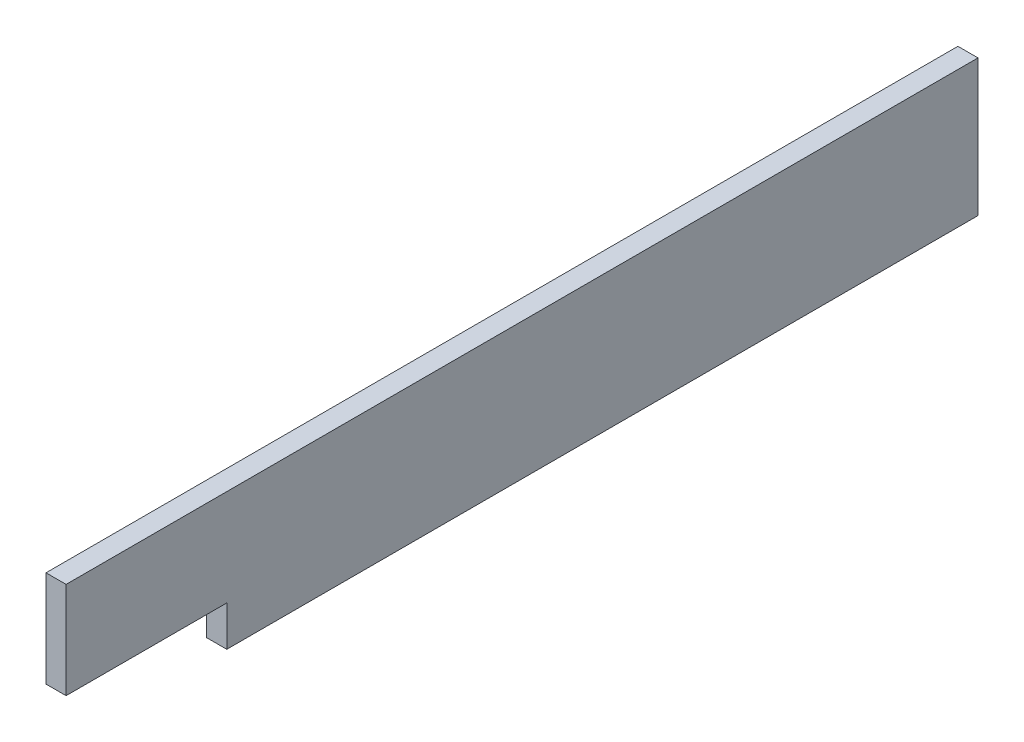
ISO-10303-21;
HEADER;
FILE_DESCRIPTION(('STEP AP214'),'2;1');
FILE_NAME('part.step','',(''),(''),'','','');
FILE_SCHEMA(('AUTOMOTIVE_DESIGN { 1 0 10303 214 1 1 1 1 }'));
ENDSEC;
DATA;
#1=APPLICATION_CONTEXT('core data for automotive mechanical design processes');
#2=APPLICATION_PROTOCOL_DEFINITION('international standard','automotive_design',2000,#1);
#3=PRODUCT_CONTEXT('',#1,'mechanical');
#4=PRODUCT('Part','Part','',(#3));
#5=PRODUCT_RELATED_PRODUCT_CATEGORY('part','',(#4));
#6=PRODUCT_DEFINITION_FORMATION('','',#4);
#7=PRODUCT_DEFINITION_CONTEXT('part definition',#1,'design');
#8=PRODUCT_DEFINITION('design','',#6,#7);
#9=PRODUCT_DEFINITION_SHAPE('','',#8);
#10=(LENGTH_UNIT() NAMED_UNIT(*) SI_UNIT(.MILLI.,.METRE.));
#11=(NAMED_UNIT(*) PLANE_ANGLE_UNIT() SI_UNIT($,.RADIAN.));
#12=(NAMED_UNIT(*) SI_UNIT($,.STERADIAN.) SOLID_ANGLE_UNIT());
#13=UNCERTAINTY_MEASURE_WITH_UNIT(LENGTH_MEASURE(1.E-05),#10,'distance_accuracy_value','');
#14=(GEOMETRIC_REPRESENTATION_CONTEXT(3) GLOBAL_UNCERTAINTY_ASSIGNED_CONTEXT((#13)) GLOBAL_UNIT_ASSIGNED_CONTEXT((#10,
#11,#12)) REPRESENTATION_CONTEXT('',''));
#15=CARTESIAN_POINT('',(0.,0.,0.));
#16=DIRECTION('',(0.,0.,1.));
#17=DIRECTION('',(1.,0.,0.));
#18=AXIS2_PLACEMENT_3D('',#15,#16,#17);
#19=CARTESIAN_POINT('',(0.,0.,288.29));
#20=DIRECTION('',(1.,0.,0.));
#21=DIRECTION('',(0.,0.,-1.));
#22=AXIS2_PLACEMENT_3D('',#19,#20,#21);
#23=PLANE('',#22);
#24=DIRECTION('',(0.,0.,-1.));
#25=VECTOR('',#24,1.);
#26=CARTESIAN_POINT('',(0.,0.,288.29));
#27=LINE('',#26,#25);
#28=CARTESIAN_POINT('',(0.,0.,237.49));
#29=VERTEX_POINT('',#28);
#30=CARTESIAN_POINT('',(0.,0.,0.));
#31=VERTEX_POINT('',#30);
#32=EDGE_CURVE('E11',#29,#31,#27,.T.);
#33=ORIENTED_EDGE('',*,*,#32,.F.);
#34=DIRECTION('',(0.,-1.,0.));
#35=VECTOR('',#34,1.);
#36=CARTESIAN_POINT('',(0.,0.,237.49));
#37=LINE('',#36,#35);
#38=CARTESIAN_POINT('',(0.,12.7,237.49));
#39=VERTEX_POINT('',#38);
#40=EDGE_CURVE('E134',#39,#29,#37,.T.);
#41=ORIENTED_EDGE('',*,*,#40,.F.);
#42=DIRECTION('',(0.,0.,-1.));
#43=VECTOR('',#42,1.);
#44=CARTESIAN_POINT('',(0.,12.7,288.29));
#45=LINE('',#44,#43);
#46=CARTESIAN_POINT('',(0.,12.7,288.29));
#47=VERTEX_POINT('',#46);
#48=EDGE_CURVE('E163',#47,#39,#45,.T.);
#49=ORIENTED_EDGE('',*,*,#48,.F.);
#50=DIRECTION('',(0.,-1.,0.));
#51=VECTOR('',#50,1.);
#52=CARTESIAN_POINT('',(0.,0.,288.29));
#53=LINE('',#52,#51);
#54=CARTESIAN_POINT('',(0.,43.18,288.29));
#55=VERTEX_POINT('',#54);
#56=EDGE_CURVE('E92',#55,#47,#53,.T.);
#57=ORIENTED_EDGE('',*,*,#56,.F.);
#58=DIRECTION('',(0.,0.,-1.));
#59=VECTOR('',#58,1.);
#60=CARTESIAN_POINT('',(0.,43.18,288.29));
#61=LINE('',#60,#59);
#62=CARTESIAN_POINT('',(0.,43.18,0.));
#63=VERTEX_POINT('',#62);
#64=EDGE_CURVE('E84',#55,#63,#61,.T.);
#65=ORIENTED_EDGE('',*,*,#64,.T.);
#66=DIRECTION('',(0.,-1.,0.));
#67=VECTOR('',#66,1.);
#68=CARTESIAN_POINT('',(0.,0.,0.));
#69=LINE('',#68,#67);
#70=EDGE_CURVE('E98',#63,#31,#69,.T.);
#71=ORIENTED_EDGE('',*,*,#70,.T.);
#72=EDGE_LOOP('',(#33,#41,#49,#57,#65,#71));
#73=FACE_BOUND('',#72,.T.);
#74=ADVANCED_FACE('F39',(#73),#23,.F.);
#75=CARTESIAN_POINT('',(0.,0.,288.29));
#76=DIRECTION('',(0.,1.,0.));
#77=DIRECTION('',(0.,0.,1.));
#78=AXIS2_PLACEMENT_3D('',#75,#76,#77);
#79=PLANE('',#78);
#80=DIRECTION('',(0.,0.,-1.));
#81=VECTOR('',#80,1.);
#82=CARTESIAN_POINT('',(6.35,0.,288.29));
#83=LINE('',#82,#81);
#84=CARTESIAN_POINT('',(6.35,0.,237.49));
#85=VERTEX_POINT('',#84);
#86=CARTESIAN_POINT('',(6.35,0.,0.));
#87=VERTEX_POINT('',#86);
#88=EDGE_CURVE('E47',#85,#87,#83,.T.);
#89=ORIENTED_EDGE('',*,*,#88,.F.);
#90=DIRECTION('',(-1.,0.,0.));
#91=VECTOR('',#90,1.);
#92=CARTESIAN_POINT('',(6.351,0.,237.49));
#93=LINE('',#92,#91);
#94=EDGE_CURVE('E111',#85,#29,#93,.T.);
#95=ORIENTED_EDGE('',*,*,#94,.T.);
#96=ORIENTED_EDGE('',*,*,#32,.T.);
#97=DIRECTION('',(1.,0.,0.));
#98=VECTOR('',#97,1.);
#99=CARTESIAN_POINT('',(0.,0.,0.));
#100=LINE('',#99,#98);
#101=EDGE_CURVE('E105',#31,#87,#100,.T.);
#102=ORIENTED_EDGE('',*,*,#101,.T.);
#103=EDGE_LOOP('',(#89,#95,#96,#102));
#104=FACE_BOUND('',#103,.T.);
#105=ADVANCED_FACE('F128',(#104),#79,.F.);
#106=CARTESIAN_POINT('',(6.35,0.,288.29));
#107=DIRECTION('',(-1.,0.,0.));
#108=DIRECTION('',(0.,0.,1.));
#109=AXIS2_PLACEMENT_3D('',#106,#107,#108);
#110=PLANE('',#109);
#111=DIRECTION('',(0.,0.,1.));
#112=VECTOR('',#111,1.);
#113=CARTESIAN_POINT('',(6.35,12.7,288.29));
#114=LINE('',#113,#112);
#115=CARTESIAN_POINT('',(6.35,12.7,237.49));
#116=VERTEX_POINT('',#115);
#117=CARTESIAN_POINT('',(6.35,12.7,288.29));
#118=VERTEX_POINT('',#117);
#119=EDGE_CURVE('E54',#116,#118,#114,.T.);
#120=ORIENTED_EDGE('',*,*,#119,.F.);
#121=DIRECTION('',(0.,1.,0.));
#122=VECTOR('',#121,1.);
#123=CARTESIAN_POINT('',(6.35,0.,237.49));
#124=LINE('',#123,#122);
#125=EDGE_CURVE('E125',#85,#116,#124,.T.);
#126=ORIENTED_EDGE('',*,*,#125,.F.);
#127=ORIENTED_EDGE('',*,*,#88,.T.);
#128=DIRECTION('',(0.,1.,0.));
#129=VECTOR('',#128,1.);
#130=CARTESIAN_POINT('',(6.35,0.,0.));
#131=LINE('',#130,#129);
#132=CARTESIAN_POINT('',(6.35,43.18,0.));
#133=VERTEX_POINT('',#132);
#134=EDGE_CURVE('E93',#87,#133,#131,.T.);
#135=ORIENTED_EDGE('',*,*,#134,.T.);
#136=DIRECTION('',(0.,0.,-1.));
#137=VECTOR('',#136,1.);
#138=CARTESIAN_POINT('',(6.35,43.18,288.29));
#139=LINE('',#138,#137);
#140=CARTESIAN_POINT('',(6.35,43.18,288.29));
#141=VERTEX_POINT('',#140);
#142=EDGE_CURVE('E87',#141,#133,#139,.T.);
#143=ORIENTED_EDGE('',*,*,#142,.F.);
#144=DIRECTION('',(0.,1.,0.));
#145=VECTOR('',#144,1.);
#146=CARTESIAN_POINT('',(6.35,0.,288.29));
#147=LINE('',#146,#145);
#148=EDGE_CURVE('E156',#118,#141,#147,.T.);
#149=ORIENTED_EDGE('',*,*,#148,.F.);
#150=EDGE_LOOP('',(#120,#126,#127,#135,#143,#149));
#151=FACE_BOUND('',#150,.T.);
#152=ADVANCED_FACE('F123',(#151),#110,.F.);
#153=CARTESIAN_POINT('',(0.,43.18,288.29));
#154=DIRECTION('',(0.,-1.,0.));
#155=DIRECTION('',(0.,0.,-1.));
#156=AXIS2_PLACEMENT_3D('',#153,#154,#155);
#157=PLANE('',#156);
#158=DIRECTION('',(-1.,0.,0.));
#159=VECTOR('',#158,1.);
#160=CARTESIAN_POINT('',(0.,43.18,0.));
#161=LINE('',#160,#159);
#162=EDGE_CURVE('E81',#133,#63,#161,.T.);
#163=ORIENTED_EDGE('',*,*,#162,.T.);
#164=ORIENTED_EDGE('',*,*,#64,.F.);
#165=DIRECTION('',(-1.,0.,0.));
#166=VECTOR('',#165,1.);
#167=CARTESIAN_POINT('',(0.,43.18,288.29));
#168=LINE('',#167,#166);
#169=EDGE_CURVE('E63',#141,#55,#168,.T.);
#170=ORIENTED_EDGE('',*,*,#169,.F.);
#171=ORIENTED_EDGE('',*,*,#142,.T.);
#172=EDGE_LOOP('',(#163,#164,#170,#171));
#173=FACE_BOUND('',#172,.T.);
#174=ADVANCED_FACE('F83',(#173),#157,.F.);
#175=CARTESIAN_POINT('',(0.,0.,288.29));
#176=DIRECTION('',(0.,0.,-1.));
#177=DIRECTION('',(-1.,0.,0.));
#178=AXIS2_PLACEMENT_3D('',#175,#176,#177);
#179=PLANE('',#178);
#180=ORIENTED_EDGE('',*,*,#56,.T.);
#181=DIRECTION('',(-1.,0.,0.));
#182=VECTOR('',#181,1.);
#183=CARTESIAN_POINT('',(6.351,12.7,288.29));
#184=LINE('',#183,#182);
#185=EDGE_CURVE('E148',#118,#47,#184,.T.);
#186=ORIENTED_EDGE('',*,*,#185,.F.);
#187=ORIENTED_EDGE('',*,*,#148,.T.);
#188=ORIENTED_EDGE('',*,*,#169,.T.);
#189=EDGE_LOOP('',(#180,#186,#187,#188));
#190=FACE_BOUND('',#189,.T.);
#191=ADVANCED_FACE('F160',(#190),#179,.F.);
#192=CARTESIAN_POINT('',(0.,0.,0.));
#193=DIRECTION('',(0.,0.,-1.));
#194=DIRECTION('',(-1.,0.,0.));
#195=AXIS2_PLACEMENT_3D('',#192,#193,#194);
#196=PLANE('',#195);
#197=ORIENTED_EDGE('',*,*,#70,.F.);
#198=ORIENTED_EDGE('',*,*,#162,.F.);
#199=ORIENTED_EDGE('',*,*,#134,.F.);
#200=ORIENTED_EDGE('',*,*,#101,.F.);
#201=EDGE_LOOP('',(#197,#198,#199,#200));
#202=FACE_BOUND('',#201,.T.);
#203=ADVANCED_FACE('F103',(#202),#196,.T.);
#204=CARTESIAN_POINT('',(6.351,0.,237.49));
#205=DIRECTION('',(0.,0.,-1.));
#206=DIRECTION('',(-1.,0.,0.));
#207=AXIS2_PLACEMENT_3D('',#204,#205,#206);
#208=PLANE('',#207);
#209=ORIENTED_EDGE('',*,*,#125,.T.);
#210=DIRECTION('',(-1.,0.,0.));
#211=VECTOR('',#210,1.);
#212=CARTESIAN_POINT('',(6.351,12.7,237.49));
#213=LINE('',#212,#211);
#214=EDGE_CURVE('E145',#116,#39,#213,.T.);
#215=ORIENTED_EDGE('',*,*,#214,.T.);
#216=ORIENTED_EDGE('',*,*,#40,.T.);
#217=ORIENTED_EDGE('',*,*,#94,.F.);
#218=EDGE_LOOP('',(#209,#215,#216,#217));
#219=FACE_BOUND('',#218,.T.);
#220=ADVANCED_FACE('F143',(#219),#208,.F.);
#221=CARTESIAN_POINT('',(6.351,12.7,288.29));
#222=DIRECTION('',(0.,1.,0.));
#223=DIRECTION('',(0.,0.,1.));
#224=AXIS2_PLACEMENT_3D('',#221,#222,#223);
#225=PLANE('',#224);
#226=ORIENTED_EDGE('',*,*,#119,.T.);
#227=ORIENTED_EDGE('',*,*,#185,.T.);
#228=ORIENTED_EDGE('',*,*,#48,.T.);
#229=ORIENTED_EDGE('',*,*,#214,.F.);
#230=EDGE_LOOP('',(#226,#227,#228,#229));
#231=FACE_BOUND('',#230,.T.);
#232=ADVANCED_FACE('F162',(#231),#225,.F.);
#233=CLOSED_SHELL('',(#74,#105,#152,#174,#191,#203,#220,#232));
#234=MANIFOLD_SOLID_BREP('B2',#233);
#235=ADVANCED_BREP_SHAPE_REPRESENTATION('',(#18,#234),#14);
#236=SHAPE_DEFINITION_REPRESENTATION(#9,#235);
ENDSEC;
END-ISO-10303-21;
